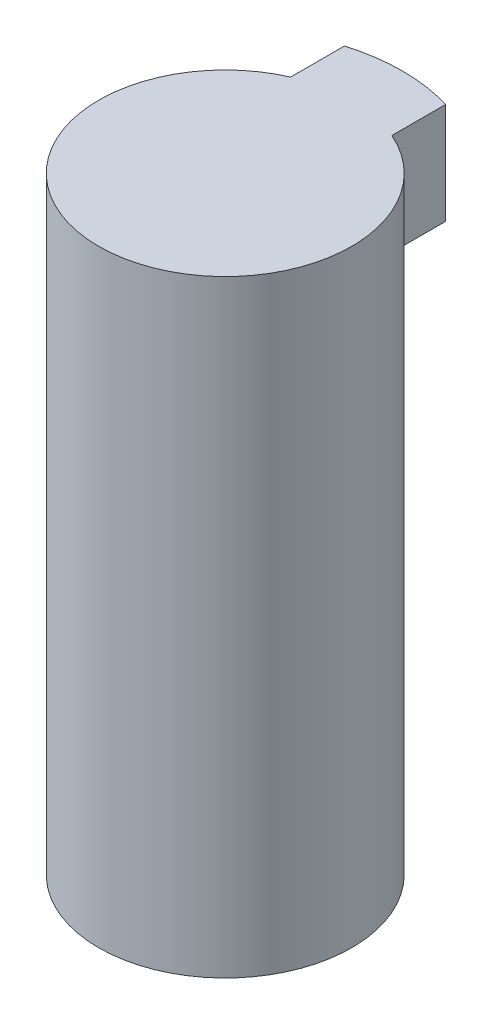
ISO-10303-21;
HEADER;
FILE_DESCRIPTION(('STEP AP214'),'2;1');
FILE_NAME('part.step','',(''),(''),'','','');
FILE_SCHEMA(('AUTOMOTIVE_DESIGN { 1 0 10303 214 1 1 1 1 }'));
ENDSEC;
DATA;
#1=APPLICATION_CONTEXT('core data for automotive mechanical design processes');
#2=APPLICATION_PROTOCOL_DEFINITION('international standard','automotive_design',2000,#1);
#3=PRODUCT_CONTEXT('',#1,'mechanical');
#4=PRODUCT('Part','Part','',(#3));
#5=PRODUCT_RELATED_PRODUCT_CATEGORY('part','',(#4));
#6=PRODUCT_DEFINITION_FORMATION('','',#4);
#7=PRODUCT_DEFINITION_CONTEXT('part definition',#1,'design');
#8=PRODUCT_DEFINITION('design','',#6,#7);
#9=PRODUCT_DEFINITION_SHAPE('','',#8);
#10=(LENGTH_UNIT() NAMED_UNIT(*) SI_UNIT(.MILLI.,.METRE.));
#11=(NAMED_UNIT(*) PLANE_ANGLE_UNIT() SI_UNIT($,.RADIAN.));
#12=(NAMED_UNIT(*) SI_UNIT($,.STERADIAN.) SOLID_ANGLE_UNIT());
#13=UNCERTAINTY_MEASURE_WITH_UNIT(LENGTH_MEASURE(1.E-05),#10,'distance_accuracy_value','');
#14=(GEOMETRIC_REPRESENTATION_CONTEXT(3) GLOBAL_UNCERTAINTY_ASSIGNED_CONTEXT((#13)) GLOBAL_UNIT_ASSIGNED_CONTEXT((#10,
#11,#12)) REPRESENTATION_CONTEXT('',''));
#15=CARTESIAN_POINT('',(0.,0.,0.));
#16=DIRECTION('',(0.,0.,1.));
#17=DIRECTION('',(1.,0.,0.));
#18=AXIS2_PLACEMENT_3D('',#15,#16,#17);
#19=CARTESIAN_POINT('',(0.,12.7,0.));
#20=DIRECTION('',(0.,-1.,0.));
#21=DIRECTION('',(0.,0.,-1.));
#22=AXIS2_PLACEMENT_3D('',#19,#20,#21);
#23=CYLINDRICAL_SURFACE('',#22,2.54);
#24=CARTESIAN_POINT('',(0.,12.7,0.));
#25=DIRECTION('',(0.,1.,0.));
#26=DIRECTION('',(0.,0.,1.));
#27=AXIS2_PLACEMENT_3D('',#24,#25,#26);
#28=CIRCLE('',#27,2.54);
#29=CARTESIAN_POINT('',(0.,12.7,2.54));
#30=VERTEX_POINT('',#29);
#31=EDGE_CURVE('E108',#30,#30,#28,.T.);
#32=ORIENTED_EDGE('',*,*,#31,.T.);
#33=EDGE_LOOP('',(#32));
#34=FACE_BOUND('',#33,.T.);
#35=CARTESIAN_POINT('',(0.,0.,0.));
#36=DIRECTION('',(0.,1.,0.));
#37=DIRECTION('',(0.,0.,1.));
#38=AXIS2_PLACEMENT_3D('',#35,#36,#37);
#39=CIRCLE('',#38,2.54);
#40=CARTESIAN_POINT('',(0.,0.,2.54));
#41=VERTEX_POINT('',#40);
#42=EDGE_CURVE('E110',#41,#41,#39,.T.);
#43=ORIENTED_EDGE('',*,*,#42,.F.);
#44=EDGE_LOOP('',(#43));
#45=FACE_BOUND('',#44,.T.);
#46=ADVANCED_FACE('F32',(#34,#45),#23,.F.);
#47=CARTESIAN_POINT('',(0.,12.7,0.));
#48=DIRECTION('',(0.,-1.,0.));
#49=DIRECTION('',(0.,0.,-1.));
#50=AXIS2_PLACEMENT_3D('',#47,#48,#49);
#51=CYLINDRICAL_SURFACE('',#50,3.175);
#52=CARTESIAN_POINT('',(0.,12.7,0.));
#53=DIRECTION('',(0.,1.,0.));
#54=DIRECTION('',(0.,0.,1.));
#55=AXIS2_PLACEMENT_3D('',#52,#53,#54);
#56=CIRCLE('',#55,3.175);
#57=CARTESIAN_POINT('',(1.27,12.7,-2.90993556629696));
#58=VERTEX_POINT('',#57);
#59=CARTESIAN_POINT('',(-1.27,12.7,-2.90993556629696));
#60=VERTEX_POINT('',#59);
#61=EDGE_CURVE('E11',#58,#60,#56,.T.);
#62=ORIENTED_EDGE('',*,*,#61,.F.);
#63=DIRECTION('',(0.,-1.,0.));
#64=VECTOR('',#63,1.);
#65=CARTESIAN_POINT('',(1.27,15.24,-2.90993556629696));
#66=LINE('',#65,#64);
#67=CARTESIAN_POINT('',(1.27,15.24,-2.90993556629696));
#68=VERTEX_POINT('',#67);
#69=EDGE_CURVE('E91',#68,#58,#66,.T.);
#70=ORIENTED_EDGE('',*,*,#69,.F.);
#71=CARTESIAN_POINT('',(0.,15.24,0.));
#72=DIRECTION('',(0.,1.,0.));
#73=DIRECTION('',(0.,0.,1.));
#74=AXIS2_PLACEMENT_3D('',#71,#72,#73);
#75=CIRCLE('',#74,3.175);
#76=CARTESIAN_POINT('',(-1.27,15.24,-2.90993556629696));
#77=VERTEX_POINT('',#76);
#78=EDGE_CURVE('E79',#77,#68,#75,.T.);
#79=ORIENTED_EDGE('',*,*,#78,.F.);
#80=DIRECTION('',(0.,-1.,0.));
#81=VECTOR('',#80,1.);
#82=CARTESIAN_POINT('',(-1.27,15.24,-2.90993556629696));
#83=LINE('',#82,#81);
#84=EDGE_CURVE('E86',#77,#60,#83,.T.);
#85=ORIENTED_EDGE('',*,*,#84,.T.);
#86=EDGE_LOOP('',(#62,#70,#79,#85));
#87=FACE_BOUND('',#86,.T.);
#88=CARTESIAN_POINT('',(0.,0.,0.));
#89=DIRECTION('',(0.,1.,0.));
#90=DIRECTION('',(0.,0.,1.));
#91=AXIS2_PLACEMENT_3D('',#88,#89,#90);
#92=CIRCLE('',#91,3.175);
#93=CARTESIAN_POINT('',(0.,0.,3.175));
#94=VERTEX_POINT('',#93);
#95=EDGE_CURVE('E35',#94,#94,#92,.T.);
#96=ORIENTED_EDGE('',*,*,#95,.T.);
#97=EDGE_LOOP('',(#96));
#98=FACE_BOUND('',#97,.T.);
#99=ADVANCED_FACE('F93',(#87,#98),#51,.T.);
#100=CARTESIAN_POINT('',(0.,0.,0.));
#101=DIRECTION('',(0.,1.,0.));
#102=DIRECTION('',(0.,0.,1.));
#103=AXIS2_PLACEMENT_3D('',#100,#101,#102);
#104=PLANE('',#103);
#105=ORIENTED_EDGE('',*,*,#42,.T.);
#106=EDGE_LOOP('',(#105));
#107=FACE_BOUND('',#106,.T.);
#108=ORIENTED_EDGE('',*,*,#95,.F.);
#109=EDGE_LOOP('',(#108));
#110=FACE_BOUND('',#109,.T.);
#111=ADVANCED_FACE('F117',(#107,#110),#104,.F.);
#112=CARTESIAN_POINT('',(0.,15.24,0.));
#113=DIRECTION('',(0.,1.,0.));
#114=DIRECTION('',(0.,0.,1.));
#115=AXIS2_PLACEMENT_3D('',#112,#113,#114);
#116=PLANE('',#115);
#117=CARTESIAN_POINT('',(0.,15.24,0.));
#118=DIRECTION('',(0.,1.,0.));
#119=DIRECTION('',(0.,0.,1.));
#120=AXIS2_PLACEMENT_3D('',#117,#118,#119);
#121=CIRCLE('',#120,4.445);
#122=CARTESIAN_POINT('',(1.27,15.24,-4.2597094971371));
#123=VERTEX_POINT('',#122);
#124=CARTESIAN_POINT('',(-1.27,15.24,-4.2597094971371));
#125=VERTEX_POINT('',#124);
#126=EDGE_CURVE('E82',#123,#125,#121,.T.);
#127=ORIENTED_EDGE('',*,*,#126,.T.);
#128=DIRECTION('',(0.,0.,1.));
#129=VECTOR('',#128,1.);
#130=CARTESIAN_POINT('',(-1.27,15.24,-4.2597094971371));
#131=LINE('',#130,#129);
#132=EDGE_CURVE('E76',#125,#77,#131,.T.);
#133=ORIENTED_EDGE('',*,*,#132,.T.);
#134=ORIENTED_EDGE('',*,*,#78,.T.);
#135=DIRECTION('',(0.,0.,-1.));
#136=VECTOR('',#135,1.);
#137=CARTESIAN_POINT('',(1.27,15.24,-4.2597094971371));
#138=LINE('',#137,#136);
#139=EDGE_CURVE('E54',#68,#123,#138,.T.);
#140=ORIENTED_EDGE('',*,*,#139,.T.);
#141=EDGE_LOOP('',(#127,#133,#134,#140));
#142=FACE_BOUND('',#141,.T.);
#143=ADVANCED_FACE('F77',(#142),#116,.T.);
#144=CARTESIAN_POINT('',(1.27,15.24,-4.2597094971371));
#145=DIRECTION('',(-1.,0.,0.));
#146=DIRECTION('',(0.,0.,1.));
#147=AXIS2_PLACEMENT_3D('',#144,#145,#146);
#148=PLANE('',#147);
#149=DIRECTION('',(0.,0.,-1.));
#150=VECTOR('',#149,1.);
#151=CARTESIAN_POINT('',(1.27,12.7,-4.2597094971371));
#152=LINE('',#151,#150);
#153=CARTESIAN_POINT('',(1.27,12.7,-4.2597094971371));
#154=VERTEX_POINT('',#153);
#155=EDGE_CURVE('E68',#58,#154,#152,.T.);
#156=ORIENTED_EDGE('',*,*,#155,.T.);
#157=DIRECTION('',(0.,-1.,0.));
#158=VECTOR('',#157,1.);
#159=CARTESIAN_POINT('',(1.27,15.24,-4.2597094971371));
#160=LINE('',#159,#158);
#161=EDGE_CURVE('E96',#123,#154,#160,.T.);
#162=ORIENTED_EDGE('',*,*,#161,.F.);
#163=ORIENTED_EDGE('',*,*,#139,.F.);
#164=ORIENTED_EDGE('',*,*,#69,.T.);
#165=EDGE_LOOP('',(#156,#162,#163,#164));
#166=FACE_BOUND('',#165,.T.);
#167=ADVANCED_FACE('F124',(#166),#148,.F.);
#168=CARTESIAN_POINT('',(-1.27,15.24,-4.2597094971371));
#169=DIRECTION('',(1.,0.,0.));
#170=DIRECTION('',(0.,0.,-1.));
#171=AXIS2_PLACEMENT_3D('',#168,#169,#170);
#172=PLANE('',#171);
#173=DIRECTION('',(0.,0.,1.));
#174=VECTOR('',#173,1.);
#175=CARTESIAN_POINT('',(-1.27,12.7,-4.2597094971371));
#176=LINE('',#175,#174);
#177=CARTESIAN_POINT('',(-1.27,12.7,-4.2597094971371));
#178=VERTEX_POINT('',#177);
#179=EDGE_CURVE('E88',#178,#60,#176,.T.);
#180=ORIENTED_EDGE('',*,*,#179,.T.);
#181=ORIENTED_EDGE('',*,*,#84,.F.);
#182=ORIENTED_EDGE('',*,*,#132,.F.);
#183=DIRECTION('',(0.,-1.,0.));
#184=VECTOR('',#183,1.);
#185=CARTESIAN_POINT('',(-1.27,15.24,-4.2597094971371));
#186=LINE('',#185,#184);
#187=EDGE_CURVE('E90',#125,#178,#186,.T.);
#188=ORIENTED_EDGE('',*,*,#187,.T.);
#189=EDGE_LOOP('',(#180,#181,#182,#188));
#190=FACE_BOUND('',#189,.T.);
#191=ADVANCED_FACE('F87',(#190),#172,.F.);
#192=CARTESIAN_POINT('',(0.,15.24,0.));
#193=DIRECTION('',(0.,-1.,0.));
#194=DIRECTION('',(0.,0.,-1.));
#195=AXIS2_PLACEMENT_3D('',#192,#193,#194);
#196=CYLINDRICAL_SURFACE('',#195,4.445);
#197=CARTESIAN_POINT('',(0.,12.7,0.));
#198=DIRECTION('',(0.,1.,0.));
#199=DIRECTION('',(0.,0.,1.));
#200=AXIS2_PLACEMENT_3D('',#197,#198,#199);
#201=CIRCLE('',#200,4.445);
#202=EDGE_CURVE('E100',#154,#178,#201,.T.);
#203=ORIENTED_EDGE('',*,*,#202,.T.);
#204=ORIENTED_EDGE('',*,*,#187,.F.);
#205=ORIENTED_EDGE('',*,*,#126,.F.);
#206=ORIENTED_EDGE('',*,*,#161,.T.);
#207=EDGE_LOOP('',(#203,#204,#205,#206));
#208=FACE_BOUND('',#207,.T.);
#209=ADVANCED_FACE('F141',(#208),#196,.T.);
#210=CARTESIAN_POINT('',(0.,12.7,0.));
#211=DIRECTION('',(0.,1.,0.));
#212=DIRECTION('',(0.,0.,1.));
#213=AXIS2_PLACEMENT_3D('',#210,#211,#212);
#214=PLANE('',#213);
#215=ORIENTED_EDGE('',*,*,#155,.F.);
#216=ORIENTED_EDGE('',*,*,#61,.T.);
#217=ORIENTED_EDGE('',*,*,#179,.F.);
#218=ORIENTED_EDGE('',*,*,#202,.F.);
#219=EDGE_LOOP('',(#215,#216,#217,#218));
#220=FACE_BOUND('',#219,.T.);
#221=ADVANCED_FACE('F136',(#220),#214,.F.);
#222=ORIENTED_EDGE('',*,*,#31,.F.);
#223=EDGE_LOOP('',(#222));
#224=FACE_BOUND('',#223,.T.);
#225=ADVANCED_FACE('F134',(#224),#214,.F.);
#226=CLOSED_SHELL('',(#46,#99,#111,#143,#167,#191,#209,#221,#225));
#227=MANIFOLD_SOLID_BREP('B2',#226);
#228=ADVANCED_BREP_SHAPE_REPRESENTATION('',(#18,#227),#14);
#229=SHAPE_DEFINITION_REPRESENTATION(#9,#228);
ENDSEC;
END-ISO-10303-21;
